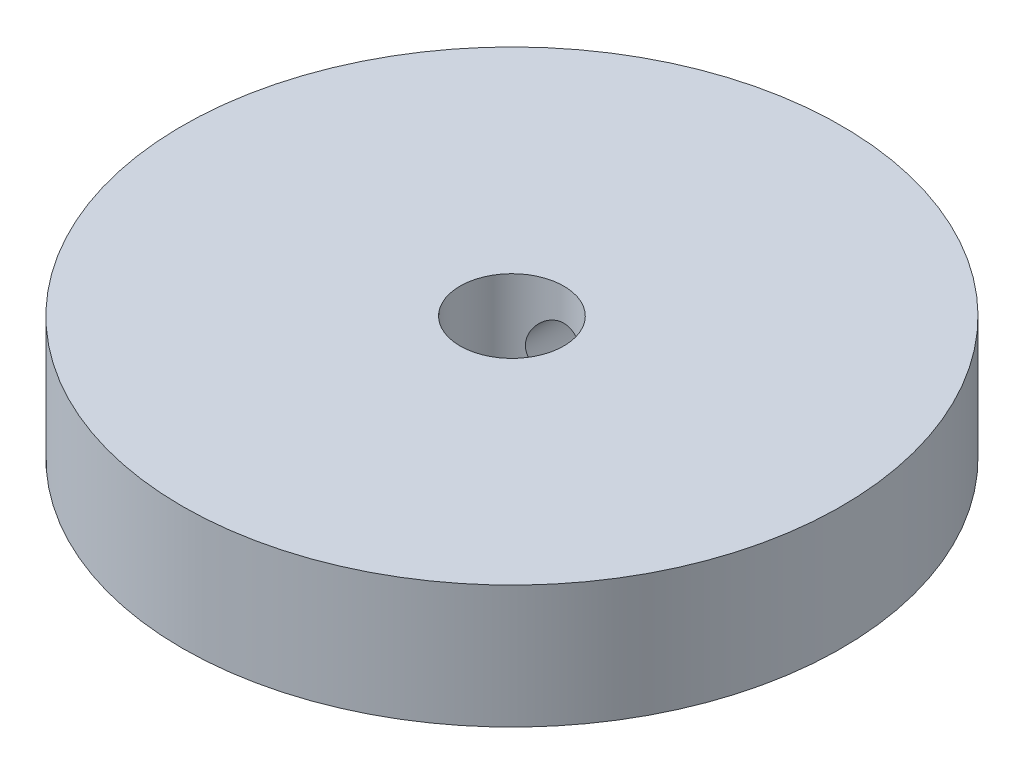
ISO-10303-21;
HEADER;
FILE_DESCRIPTION(('STEP AP214'),'2;1');
FILE_NAME('part.step','',(''),(''),'','','');
FILE_SCHEMA(('AUTOMOTIVE_DESIGN { 1 0 10303 214 1 1 1 1 }'));
ENDSEC;
DATA;
#1=APPLICATION_CONTEXT('core data for automotive mechanical design processes');
#2=APPLICATION_PROTOCOL_DEFINITION('international standard','automotive_design',2000,#1);
#3=PRODUCT_CONTEXT('',#1,'mechanical');
#4=PRODUCT('Part','Part','',(#3));
#5=PRODUCT_RELATED_PRODUCT_CATEGORY('part','',(#4));
#6=PRODUCT_DEFINITION_FORMATION('','',#4);
#7=PRODUCT_DEFINITION_CONTEXT('part definition',#1,'design');
#8=PRODUCT_DEFINITION('design','',#6,#7);
#9=PRODUCT_DEFINITION_SHAPE('','',#8);
#10=(LENGTH_UNIT() NAMED_UNIT(*) SI_UNIT(.MILLI.,.METRE.));
#11=(NAMED_UNIT(*) PLANE_ANGLE_UNIT() SI_UNIT($,.RADIAN.));
#12=(NAMED_UNIT(*) SI_UNIT($,.STERADIAN.) SOLID_ANGLE_UNIT());
#13=UNCERTAINTY_MEASURE_WITH_UNIT(LENGTH_MEASURE(1.E-05),#10,'distance_accuracy_value','');
#14=(GEOMETRIC_REPRESENTATION_CONTEXT(3) GLOBAL_UNCERTAINTY_ASSIGNED_CONTEXT((#13)) GLOBAL_UNIT_ASSIGNED_CONTEXT((#10,
#11,#12)) REPRESENTATION_CONTEXT('',''));
#15=CARTESIAN_POINT('',(0.,0.,0.));
#16=DIRECTION('',(0.,0.,1.));
#17=DIRECTION('',(1.,0.,0.));
#18=AXIS2_PLACEMENT_3D('',#15,#16,#17);
#19=CARTESIAN_POINT('',(0.,2.5,0.));
#20=DIRECTION('',(0.,1.,0.));
#21=DIRECTION('',(0.,0.,1.));
#22=AXIS2_PLACEMENT_3D('',#19,#20,#21);
#23=PLANE('',#22);
#24=CARTESIAN_POINT('',(0.,2.5,0.));
#25=DIRECTION('',(0.,1.,0.));
#26=DIRECTION('',(0.,0.,1.));
#27=AXIS2_PLACEMENT_3D('',#24,#25,#26);
#28=CIRCLE('',#27,13.3985);
#29=CARTESIAN_POINT('',(0.,2.5,13.3985));
#30=VERTEX_POINT('',#29);
#31=EDGE_CURVE('E10',#30,#30,#28,.T.);
#32=ORIENTED_EDGE('',*,*,#31,.T.);
#33=EDGE_LOOP('',(#32));
#34=FACE_BOUND('',#33,.T.);
#35=CARTESIAN_POINT('',(0.,2.5,0.));
#36=DIRECTION('',(0.,1.,0.));
#37=DIRECTION('',(0.,0.,1.));
#38=AXIS2_PLACEMENT_3D('',#35,#36,#37);
#39=CIRCLE('',#38,2.11);
#40=CARTESIAN_POINT('',(0.,2.5,2.11));
#41=VERTEX_POINT('',#40);
#42=EDGE_CURVE('E54',#41,#41,#39,.T.);
#43=ORIENTED_EDGE('',*,*,#42,.F.);
#44=EDGE_LOOP('',(#43));
#45=FACE_BOUND('',#44,.T.);
#46=ADVANCED_FACE('F35',(#34,#45),#23,.T.);
#47=CARTESIAN_POINT('',(0.,-2.5,0.));
#48=DIRECTION('',(0.,1.,0.));
#49=DIRECTION('',(0.,0.,1.));
#50=AXIS2_PLACEMENT_3D('',#47,#48,#49);
#51=PLANE('',#50);
#52=CARTESIAN_POINT('',(0.,-2.5,0.));
#53=DIRECTION('',(0.,1.,0.));
#54=DIRECTION('',(0.,0.,1.));
#55=AXIS2_PLACEMENT_3D('',#52,#53,#54);
#56=CIRCLE('',#55,13.3985);
#57=CARTESIAN_POINT('',(0.,-2.5,13.3985));
#58=VERTEX_POINT('',#57);
#59=EDGE_CURVE('E49',#58,#58,#56,.T.);
#60=ORIENTED_EDGE('',*,*,#59,.F.);
#61=EDGE_LOOP('',(#60));
#62=FACE_BOUND('',#61,.T.);
#63=CARTESIAN_POINT('',(0.,-2.5,0.));
#64=DIRECTION('',(0.,1.,0.));
#65=DIRECTION('',(0.,0.,1.));
#66=AXIS2_PLACEMENT_3D('',#63,#64,#65);
#67=CIRCLE('',#66,2.11);
#68=CARTESIAN_POINT('',(0.,-2.5,2.11));
#69=VERTEX_POINT('',#68);
#70=EDGE_CURVE('E56',#69,#69,#67,.T.);
#71=ORIENTED_EDGE('',*,*,#70,.T.);
#72=EDGE_LOOP('',(#71));
#73=FACE_BOUND('',#72,.T.);
#74=ADVANCED_FACE('F77',(#62,#73),#51,.F.);
#75=CARTESIAN_POINT('',(0.,2.5,0.));
#76=DIRECTION('',(0.,-1.,0.));
#77=DIRECTION('',(0.,0.,-1.));
#78=AXIS2_PLACEMENT_3D('',#75,#76,#77);
#79=CYLINDRICAL_SURFACE('',#78,13.3985);
#80=CARTESIAN_POINT('',(0.,1.19285384714238,-13.3985));
#81=CARTESIAN_POINT('',(-0.0668611088723558,1.1928509344783,-13.3984993077695));
#82=CARTESIAN_POINT('',(-0.13376731304766,1.18721344591824,-13.397994195443));
#83=CARTESIAN_POINT('',(-0.265727359509018,1.16480807297228,-13.3960277690687));
#84=CARTESIAN_POINT('',(-0.33077903612679,1.14802769021856,-13.3945653813243));
#85=CARTESIAN_POINT('',(-0.457099823963955,1.10382668072929,-13.3908496033707));
#86=CARTESIAN_POINT('',(-0.518371098234102,1.07641220523489,-13.3885966705205));
#87=CARTESIAN_POINT('',(-0.635428194760806,1.01173252008704,-13.3835522195016));
#88=CARTESIAN_POINT('',(-0.691215160429672,0.974469369764793,-13.3807608139592));
#89=CARTESIAN_POINT('',(-0.795895332793573,0.891034211440649,-13.3749434642613));
#90=CARTESIAN_POINT('',(-0.844770510331196,0.844839622114227,-13.3719169375044));
#91=CARTESIAN_POINT('',(-0.934084932389863,0.744900770682579,-13.3659753189789));
#92=CARTESIAN_POINT('',(-0.974523800165743,0.691156171591474,-13.3630602321917));
#93=CARTESIAN_POINT('',(-1.04587974752359,0.577532410746032,-13.3576654039961));
#94=CARTESIAN_POINT('',(-1.07678081239489,0.517643153824629,-13.3551863977696));
#95=CARTESIAN_POINT('',(-1.12808170407166,0.393500350821513,-13.350951291699));
#96=CARTESIAN_POINT('',(-1.14848174002052,0.329246891688142,-13.3491951774577));
#97=CARTESIAN_POINT('',(-1.17814877670798,0.198381456111746,-13.3466097257035));
#98=CARTESIAN_POINT('',(-1.18744534798244,0.131776232702476,-13.3457779269846));
#99=CARTESIAN_POINT('',(-1.19473293016617,-0.00205401527754673,-13.3451275589572));
#100=CARTESIAN_POINT('',(-1.19272418051325,-0.0692790266915698,-13.3453089681897));
#101=CARTESIAN_POINT('',(-1.1774825586108,-0.202237551544666,-13.3466622782871));
#102=CARTESIAN_POINT('',(-1.16428187139049,-0.267974787452757,-13.3478313388957));
#103=CARTESIAN_POINT('',(-1.12708112078761,-0.396296874331291,-13.3510237797162));
#104=CARTESIAN_POINT('',(-1.10308093888369,-0.458881690696452,-13.3530471693041));
#105=CARTESIAN_POINT('',(-1.04492660411706,-0.57922466562437,-13.3577235530989));
#106=CARTESIAN_POINT('',(-1.01075806293991,-0.636975835170944,-13.360377438382));
#107=CARTESIAN_POINT('',(-0.93324729024638,-0.745935727208501,-13.366014989152));
#108=CARTESIAN_POINT('',(-0.889904846321373,-0.797144298170915,-13.3689986622738));
#109=CARTESIAN_POINT('',(-0.795096327003708,-0.891752472486615,-13.3749722477405));
#110=CARTESIAN_POINT('',(-0.743602436409026,-0.935124207542759,-13.3779621455345));
#111=CARTESIAN_POINT('',(-0.634049639463746,-1.01261190405272,-13.3836014066928));
#112=CARTESIAN_POINT('',(-0.575990727866651,-1.04672785810962,-13.386250769785));
#113=CARTESIAN_POINT('',(-0.454937469909478,-1.10473402945312,-13.3909110673105));
#114=CARTESIAN_POINT('',(-0.391942501143795,-1.12862295471339,-13.3929219210698));
#115=CARTESIAN_POINT('',(-0.262813892356463,-1.16547714505376,-13.396077744201));
#116=CARTESIAN_POINT('',(-0.196680326732288,-1.17844266892629,-13.3972227340865));
#117=CARTESIAN_POINT('',(-0.0633933008826602,-1.1930469394735,-13.398515187575));
#118=CARTESIAN_POINT('',(0.00375591147261866,-1.19472416750119,-13.3986660401161));
#119=CARTESIAN_POINT('',(0.137380252003582,-1.18680512812596,-13.397962284794));
#120=CARTESIAN_POINT('',(0.203855387362542,-1.17720898098493,-13.3971076876566));
#121=CARTESIAN_POINT('',(0.334134433158405,-1.14704749515952,-13.3944912932877));
#122=CARTESIAN_POINT('',(0.397942518773648,-1.12650005144344,-13.39273097621));
#123=CARTESIAN_POINT('',(0.52120566352537,-1.07503755249463,-13.3885008031551));
#124=CARTESIAN_POINT('',(0.580660644455425,-1.04412231105317,-13.3860309344344));
#125=CARTESIAN_POINT('',(0.693704628799754,-0.972705491422899,-13.3806498870347));
#126=CARTESIAN_POINT('',(0.74727751304347,-0.932178487583904,-13.3777375453698));
#127=CARTESIAN_POINT('',(0.84687370771188,-0.842725196546674,-13.371802467277));
#128=CARTESIAN_POINT('',(0.892896868319757,-0.793798742709061,-13.3687797286599));
#129=CARTESIAN_POINT('',(0.976219704883506,-0.6887681102727,-13.3629544515132));
#130=CARTESIAN_POINT('',(1.01349422278749,-0.632643932225749,-13.3601525630532));
#131=CARTESIAN_POINT('',(1.07808904414791,-0.514910266951215,-13.3550956754067));
#132=CARTESIAN_POINT('',(1.10540945895897,-0.453300841095632,-13.3528406701025));
#133=CARTESIAN_POINT('',(1.14927792939156,-0.326433724473818,-13.3491366681396));
#134=CARTESIAN_POINT('',(1.16584124660014,-0.261181345596491,-13.3476865300058));
#135=CARTESIAN_POINT('',(1.18777498552953,-0.128808185590263,-13.3457527321026));
#136=CARTESIAN_POINT('',(1.19314565609434,-0.0616874460338942,-13.3452690508461));
#137=CARTESIAN_POINT('',(1.19253859109744,0.0722670997346852,-13.3453232931703));
#138=CARTESIAN_POINT('',(1.18660038076793,0.139101090052266,-13.3458576586178));
#139=CARTESIAN_POINT('',(1.16362668243522,0.270818358080241,-13.3478802167346));
#140=CARTESIAN_POINT('',(1.14659117880003,0.335701633042662,-13.3493684107475));
#141=CARTESIAN_POINT('',(1.10191677970823,0.461677300148702,-13.3531299922316));
#142=CARTESIAN_POINT('',(1.07427874574143,0.522769999820382,-13.3554033159069));
#143=CARTESIAN_POINT('',(1.00918811554467,0.639455038840592,-13.3604791296555));
#144=CARTESIAN_POINT('',(0.97173564134353,0.695047446565707,-13.3632816131494));
#145=CARTESIAN_POINT('',(0.887930664651643,0.799356275286915,-13.3691116619936));
#146=CARTESIAN_POINT('',(0.84154881295643,0.848049076037926,-13.37213994883));
#147=CARTESIAN_POINT('',(0.7412569235189,0.936979552051364,-13.3780737885975));
#148=CARTESIAN_POINT('',(0.687345073001175,0.977215185471472,-13.3809793117545));
#149=CARTESIAN_POINT('',(0.573405539534468,1.04815123127885,-13.386346234466));
#150=CARTESIAN_POINT('',(0.513365432359628,1.07883174082826,-13.3888067025863));
#151=CARTESIAN_POINT('',(0.389004093759821,1.12963615748012,-13.3929956690964));
#152=CARTESIAN_POINT('',(0.3246878484853,1.14977212483841,-13.394725003278));
#153=CARTESIAN_POINT('',(0.216664171343889,1.17382201215492,-13.3968159242413));
#154=CARTESIAN_POINT('',(0.173650170843607,1.1809493794807,-13.397444555291));
#155=CARTESIAN_POINT('',(0.0870971588633573,1.19046623837718,-13.3982868180104));
#156=CARTESIAN_POINT('',(0.0435581490142888,1.19285574466185,-13.3985004509688));
#157=CARTESIAN_POINT('',(0.,1.19285384714238,-13.3985));
#158=B_SPLINE_CURVE_WITH_KNOTS('',3,(#80,#81,#82,#83,#84,#85,#86,#87,#88,#89,#90,#91,#92,#93,
#94,#95,#96,#97,#98,#99,#100,#101,#102,#103,#104,#105,#106,#107,#108,#109,#110,#111,#112,#113,
#114,#115,#116,#117,#118,#119,#120,#121,#122,#123,#124,#125,#126,#127,#128,#129,#130,#131,#132,
#133,#134,#135,#136,#137,#138,#139,#140,#141,#142,#143,#144,#145,#146,#147,#148,#149,#150,#151,
#152,#153,#154,#155,#156,#157),.UNSPECIFIED.,.T.,.F.,(4,2,2,2,2,2,2,2,2,2,2,2,2,2,2,2,2,2,2,2,2,
2,2,2,2,2,2,2,2,2,2,2,2,2,2,2,2,2,4),(0.,0.200424284391749,0.401073754192963,0.601607331910992,
0.802099011729256,1.00310438390303,1.20411873056937,1.40546878252729,1.60681482414838,
1.80762344056826,2.00842780403526,2.20865665872808,2.40888771092871,2.60940344995731,
2.80992383214978,3.01114381623026,3.21236396111868,3.41360951955247,3.61485031003068,
3.81540472961328,4.015957009745,4.21618257762304,4.41641174180446,4.61717659162926,
4.8179454249526,5.0192847132782,5.22062174919103,5.42167251139128,5.62271880362024,
5.82306371605953,6.0234089107116,6.22373783011683,6.42406425883085,6.625060725404,
6.8261056636301,7.02756660997056,7.22879663052801,7.35936787149819,7.48993870696376),.UNSPECIFIED.);
#159=CARTESIAN_POINT('',(0.,1.19285384714238,-13.3985));
#160=VERTEX_POINT('',#159);
#161=EDGE_CURVE('E59',#160,#160,#158,.T.);
#162=ORIENTED_EDGE('',*,*,#161,.T.);
#163=EDGE_LOOP('',(#162));
#164=FACE_BOUND('',#163,.T.);
#165=ORIENTED_EDGE('',*,*,#31,.F.);
#166=EDGE_LOOP('',(#165));
#167=FACE_BOUND('',#166,.T.);
#168=ORIENTED_EDGE('',*,*,#59,.T.);
#169=EDGE_LOOP('',(#168));
#170=FACE_BOUND('',#169,.T.);
#171=ADVANCED_FACE('F37',(#164,#167,#170),#79,.T.);
#172=CARTESIAN_POINT('',(0.,2.5,0.));
#173=DIRECTION('',(0.,-1.,0.));
#174=DIRECTION('',(0.,0.,-1.));
#175=AXIS2_PLACEMENT_3D('',#172,#173,#174);
#176=CYLINDRICAL_SURFACE('',#175,2.11);
#177=CARTESIAN_POINT('',(0.,1.19285384714238,-2.11));
#178=CARTESIAN_POINT('',(-0.0617574750714294,1.19285725932088,-2.11000300089849));
#179=CARTESIAN_POINT('',(-0.123495716188226,1.18803773031089,-2.10726640639139));
#180=CARTESIAN_POINT('',(-0.245044404085788,1.16903235399487,-2.09661015933867));
#181=CARTESIAN_POINT('',(-0.304854738614639,1.15484596233488,-2.08869020556307));
#182=CARTESIAN_POINT('',(-0.420681081913013,1.11786145280671,-2.06847202103185));
#183=CARTESIAN_POINT('',(-0.476710230443512,1.09509518343563,-2.05618999189096));
#184=CARTESIAN_POINT('',(-0.584042301303055,1.04181971209439,-2.0283178204195));
#185=CARTESIAN_POINT('',(-0.635344043208525,1.01130858335138,-2.01272685504732));
#186=CARTESIAN_POINT('',(-0.735851869358382,0.940982604226794,-1.97829244766686));
#187=CARTESIAN_POINT('',(-0.78464991268058,0.900660658822537,-1.95929660343036));
#188=CARTESIAN_POINT('',(-0.875183802438372,0.812976773686049,-1.92056834969319));
#189=CARTESIAN_POINT('',(-0.916912105165658,0.765607414002383,-1.9008351804904));
#190=CARTESIAN_POINT('',(-0.996587121149639,0.659231786699288,-1.86040669270126));
#191=CARTESIAN_POINT('',(-1.03366592658259,0.59952447731357,-1.83983064922426));
#192=CARTESIAN_POINT('',(-1.09709858068934,0.473529046694949,-1.80272924566894));
#193=CARTESIAN_POINT('',(-1.12346828330075,0.40725083545741,-1.78619791226384));
#194=CARTESIAN_POINT('',(-1.15973238480776,0.284729667494015,-1.76280497548175));
#195=CARTESIAN_POINT('',(-1.17196007959165,0.229429580786415,-1.75462354520275));
#196=CARTESIAN_POINT('',(-1.1884379177757,0.117157365940326,-1.74350756789927));
#197=CARTESIAN_POINT('',(-1.192696332095,0.0601870337265616,-1.74056758119191));
#198=CARTESIAN_POINT('',(-1.19300296374553,-0.0538562160669354,-1.74035742084403));
#199=CARTESIAN_POINT('',(-1.1890408617938,-0.110929172618388,-1.74309437351184));
#200=CARTESIAN_POINT('',(-1.17311785359911,-0.223446980137061,-1.75384803351222));
#201=CARTESIAN_POINT('',(-1.16115156688132,-0.278890709736709,-1.76186829226891));
#202=CARTESIAN_POINT('',(-1.12983781403887,-0.386668347965161,-1.78210796023182));
#203=CARTESIAN_POINT('',(-1.11050679114826,-0.439008886393093,-1.79431800891282));
#204=CARTESIAN_POINT('',(-1.06513028833719,-0.539870321599766,-1.82161939372138));
#205=CARTESIAN_POINT('',(-1.03908221520495,-0.588389733714068,-1.83671184205489));
#206=CARTESIAN_POINT('',(-0.976279084252931,-0.688322402758243,-1.87094848907141));
#207=CARTESIAN_POINT('',(-0.938484892960434,-0.73899308122279,-1.89035674542471));
#208=CARTESIAN_POINT('',(-0.855418375966287,-0.833747288437907,-1.92936982457699));
#209=CARTESIAN_POINT('',(-0.810139856166712,-0.877825302997054,-1.9489747974501));
#210=CARTESIAN_POINT('',(-0.707467770782737,-0.962966645183049,-1.98870199025303));
#211=CARTESIAN_POINT('',(-0.649291724752304,-1.0031782735149,-2.00864783972639));
#212=CARTESIAN_POINT('',(-0.52577711291353,-1.07307181775496,-2.04445137443006));
#213=CARTESIAN_POINT('',(-0.460443186767855,-1.10276050227896,-2.06031168577808));
#214=CARTESIAN_POINT('',(-0.32918275580912,-1.14848753106721,-2.08515746596356));
#215=CARTESIAN_POINT('',(-0.263617139603072,-1.16533521428225,-2.09454611001259));
#216=CARTESIAN_POINT('',(-0.130015274128189,-1.18767450649407,-2.10705519799119));
#217=CARTESIAN_POINT('',(-0.061981422600412,-1.19317685131833,-2.11018156768394));
#218=CARTESIAN_POINT('',(0.0659290920085842,-1.19254071081616,-2.10982388837638));
#219=CARTESIAN_POINT('',(0.12581932689237,-1.18770141522079,-2.10707757871392));
#220=CARTESIAN_POINT('',(0.243778118170123,-1.16920310792516,-2.09670616082211));
#221=CARTESIAN_POINT('',(0.301846631892797,-1.15554388979192,-2.08908093840036));
#222=CARTESIAN_POINT('',(0.414218472641017,-1.12016525614226,-2.06972308218328));
#223=CARTESIAN_POINT('',(0.468547131630084,-1.09850808963624,-2.05802220861492));
#224=CARTESIAN_POINT('',(0.572845633285018,-1.04790806604572,-2.03146444760127));
#225=CARTESIAN_POINT('',(0.62281437773841,-1.01896338041181,-2.01660676821167));
#226=CARTESIAN_POINT('',(0.722556525495586,-0.951217805936896,-1.98319371962117));
#227=CARTESIAN_POINT('',(0.77177124349089,-0.911705697369848,-1.96441461202035));
#228=CARTESIAN_POINT('',(0.863253415567168,-0.825618560865327,-1.92597025072331));
#229=CARTESIAN_POINT('',(0.905512910089124,-0.779035556534037,-1.90630401412681));
#230=CARTESIAN_POINT('',(0.986496806494215,-0.674218099427441,-1.86579354832205));
#231=CARTESIAN_POINT('',(1.02435419059898,-0.615269618474589,-1.84504962283578));
#232=CARTESIAN_POINT('',(1.08950638531375,-0.490711714377117,-1.80734595331332));
#233=CARTESIAN_POINT('',(1.11681563592996,-0.425111553676109,-1.79038104950826));
#234=CARTESIAN_POINT('',(1.15502762609978,-0.303282179989335,-1.76590296686027));
#235=CARTESIAN_POINT('',(1.16817955881163,-0.248008564486306,-1.75714924212387));
#236=CARTESIAN_POINT('',(1.18648382362105,-0.135607876945395,-1.74484452502296));
#237=CARTESIAN_POINT('',(1.19164483080319,-0.0784828837008957,-1.74128789084497));
#238=CARTESIAN_POINT('',(1.193686080958,0.0360841321967521,-1.7398895598839));
#239=CARTESIAN_POINT('',(1.19055222716142,0.0935265287760523,-1.74205759191652));
#240=CARTESIAN_POINT('',(1.17616081184122,0.20692413049473,-1.75180408053421));
#241=CARTESIAN_POINT('',(1.16489806719965,0.262878363142253,-1.75938598906534));
#242=CARTESIAN_POINT('',(1.13499223072578,0.371240048763037,-1.77882044535826));
#243=CARTESIAN_POINT('',(1.11643606243429,0.423681055106933,-1.79062255218758));
#244=CARTESIAN_POINT('',(1.07260413387022,0.524846342653948,-1.81721655458141));
#245=CARTESIAN_POINT('',(1.04732584033513,0.573569213734168,-1.83200957678075));
#246=CARTESIAN_POINT('',(0.986297417193168,0.673847015679014,-1.86566539012004));
#247=CARTESIAN_POINT('',(0.94953683725679,0.724694702485637,-1.88480456622086));
#248=CARTESIAN_POINT('',(0.868591301157564,0.819977198359943,-1.9234509503068));
#249=CARTESIAN_POINT('',(0.824400272502843,0.864406706543252,-1.94295844763038));
#250=CARTESIAN_POINT('',(0.723701597614187,0.950816204828939,-1.98283001119177));
#251=CARTESIAN_POINT('',(0.66635902061374,0.991908977825259,-2.00302944130841));
#252=CARTESIAN_POINT('',(0.544386925146211,1.06374066733375,-2.0395556551276));
#253=CARTESIAN_POINT('',(0.479760545978113,1.0944840218117,-2.05588409786937));
#254=CARTESIAN_POINT('',(0.347204847236207,1.14331301148243,-2.08229592615407));
#255=CARTESIAN_POINT('',(0.279459466256875,1.16178923691723,-2.09257071092142));
#256=CARTESIAN_POINT('',(0.141132348509794,1.18655140148711,-2.10641756745869));
#257=CARTESIAN_POINT('',(0.0705536226816588,1.19284994896561,-2.10999657168206));
#258=CARTESIAN_POINT('',(0.,1.19285384714238,-2.11));
#259=B_SPLINE_CURVE_WITH_KNOTS('',3,(#177,#178,#179,#180,#181,#182,#183,#184,#185,#186,#187,
#188,#189,#190,#191,#192,#193,#194,#195,#196,#197,#198,#199,#200,#201,#202,#203,#204,#205,#206,
#207,#208,#209,#210,#211,#212,#213,#214,#215,#216,#217,#218,#219,#220,#221,#222,#223,#224,#225,
#226,#227,#228,#229,#230,#231,#232,#233,#234,#235,#236,#237,#238,#239,#240,#241,#242,#243,#244,
#245,#246,#247,#248,#249,#250,#251,#252,#253,#254,#255,#256,#257,#258),.UNSPECIFIED.,.T.,.F.,(4,
2,2,2,2,2,2,2,2,2,2,2,2,2,2,2,2,2,2,2,2,2,2,2,2,2,2,2,2,2,2,2,2,2,2,2,2,2,2,2,4),(0.,
0.184999495298661,0.37000974276411,0.554339890623992,0.738715941319595,0.936195210247483,
1.13388388850322,1.35249937676896,1.57079003271239,1.74171691325127,1.91246629870428,
2.08343015696978,2.25450905410899,2.42520820117441,2.59597334796743,2.79356186227528,
2.9913147289825,3.21061337544503,3.42977070654946,3.63360341748111,3.83724315761685,
4.01681035284657,4.19638175105333,4.37458400747919,4.55283102220121,4.74958047604946,
4.94655354753261,5.1646798979858,5.38250657411199,5.55422606718985,5.72575900763061,
5.89758364822103,6.06951794399752,6.23946239208667,6.40947097547408,6.60549080899745,
6.8016716242384,7.02068971999765,7.23961377794753,7.45118201046201,7.66253107504897),.UNSPECIFIED.);
#260=CARTESIAN_POINT('',(0.,1.19285384714238,-2.11));
#261=VERTEX_POINT('',#260);
#262=EDGE_CURVE('E40',#261,#261,#259,.T.);
#263=ORIENTED_EDGE('',*,*,#262,.F.);
#264=EDGE_LOOP('',(#263));
#265=FACE_BOUND('',#264,.T.);
#266=ORIENTED_EDGE('',*,*,#42,.T.);
#267=EDGE_LOOP('',(#266));
#268=FACE_BOUND('',#267,.T.);
#269=ORIENTED_EDGE('',*,*,#70,.F.);
#270=EDGE_LOOP('',(#269));
#271=FACE_BOUND('',#270,.T.);
#272=ADVANCED_FACE('F69',(#265,#268,#271),#176,.F.);
#273=CARTESIAN_POINT('',(0.,0.,-13.3985));
#274=DIRECTION('',(0.,0.,1.));
#275=DIRECTION('',(1.,0.,0.));
#276=AXIS2_PLACEMENT_3D('',#273,#274,#275);
#277=CYLINDRICAL_SURFACE('',#276,1.19285384714238);
#278=ORIENTED_EDGE('',*,*,#262,.T.);
#279=EDGE_LOOP('',(#278));
#280=FACE_BOUND('',#279,.T.);
#281=ORIENTED_EDGE('',*,*,#161,.F.);
#282=EDGE_LOOP('',(#281));
#283=FACE_BOUND('',#282,.T.);
#284=ADVANCED_FACE('F66',(#280,#283),#277,.F.);
#285=CLOSED_SHELL('',(#46,#74,#171,#272,#284));
#286=MANIFOLD_SOLID_BREP('B2',#285);
#287=ADVANCED_BREP_SHAPE_REPRESENTATION('',(#18,#286),#14);
#288=SHAPE_DEFINITION_REPRESENTATION(#9,#287);
ENDSEC;
END-ISO-10303-21;
